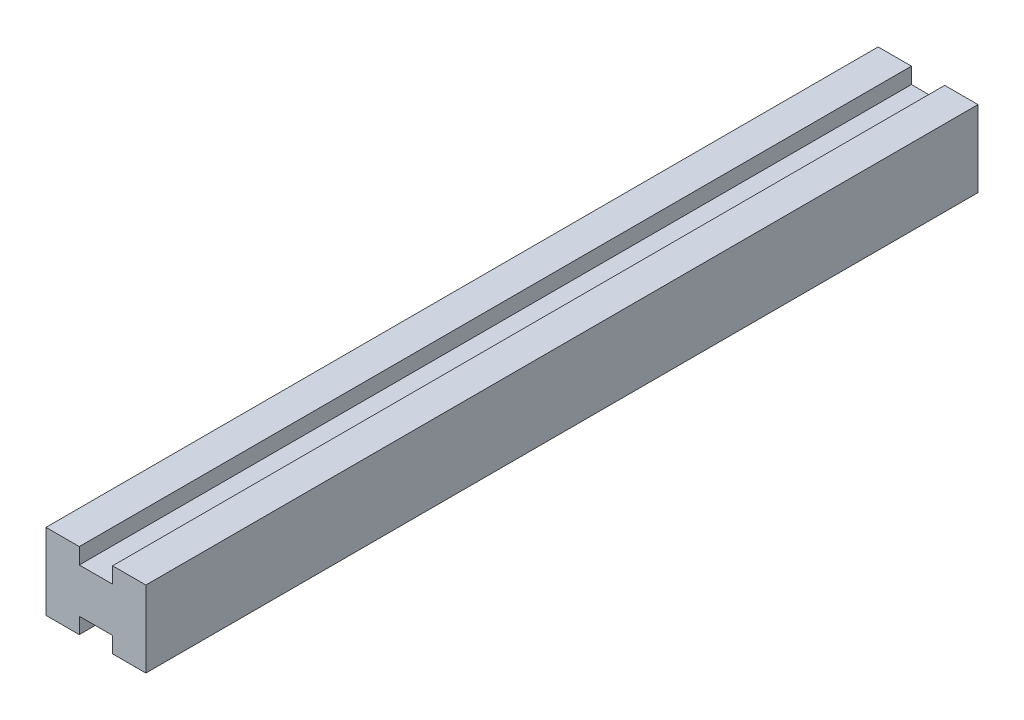
ISO-10303-21;
HEADER;
FILE_DESCRIPTION(('STEP AP214'),'2;1');
FILE_NAME('part.step','',(''),(''),'','','');
FILE_SCHEMA(('AUTOMOTIVE_DESIGN { 1 0 10303 214 1 1 1 1 }'));
ENDSEC;
DATA;
#1=APPLICATION_CONTEXT('core data for automotive mechanical design processes');
#2=APPLICATION_PROTOCOL_DEFINITION('international standard','automotive_design',2000,#1);
#3=PRODUCT_CONTEXT('',#1,'mechanical');
#4=PRODUCT('Part','Part','',(#3));
#5=PRODUCT_RELATED_PRODUCT_CATEGORY('part','',(#4));
#6=PRODUCT_DEFINITION_FORMATION('','',#4);
#7=PRODUCT_DEFINITION_CONTEXT('part definition',#1,'design');
#8=PRODUCT_DEFINITION('design','',#6,#7);
#9=PRODUCT_DEFINITION_SHAPE('','',#8);
#10=(LENGTH_UNIT() NAMED_UNIT(*) SI_UNIT(.MILLI.,.METRE.));
#11=(NAMED_UNIT(*) PLANE_ANGLE_UNIT() SI_UNIT($,.RADIAN.));
#12=(NAMED_UNIT(*) SI_UNIT($,.STERADIAN.) SOLID_ANGLE_UNIT());
#13=UNCERTAINTY_MEASURE_WITH_UNIT(LENGTH_MEASURE(1.E-05),#10,'distance_accuracy_value','');
#14=(GEOMETRIC_REPRESENTATION_CONTEXT(3) GLOBAL_UNCERTAINTY_ASSIGNED_CONTEXT((#13)) GLOBAL_UNIT_ASSIGNED_CONTEXT((#10,
#11,#12)) REPRESENTATION_CONTEXT('',''));
#15=CARTESIAN_POINT('',(0.,0.,0.));
#16=DIRECTION('',(0.,0.,1.));
#17=DIRECTION('',(1.,0.,0.));
#18=AXIS2_PLACEMENT_3D('',#15,#16,#17);
#19=CARTESIAN_POINT('',(-1.2,2.75,60.));
#20=DIRECTION('',(1.,0.,0.));
#21=DIRECTION('',(0.,1.,0.));
#22=AXIS2_PLACEMENT_3D('',#19,#20,#21);
#23=PLANE('',#22);
#24=DIRECTION('',(0.,-1.,0.));
#25=VECTOR('',#24,1.);
#26=CARTESIAN_POINT('',(-1.2,2.75,0.));
#27=LINE('',#26,#25);
#28=CARTESIAN_POINT('',(-1.2,2.75,0.));
#29=VERTEX_POINT('',#28);
#30=CARTESIAN_POINT('',(-1.2,1.6,0.));
#31=VERTEX_POINT('',#30);
#32=EDGE_CURVE('E155',#29,#31,#27,.T.);
#33=ORIENTED_EDGE('',*,*,#32,.F.);
#34=DIRECTION('',(0.,0.,-1.));
#35=VECTOR('',#34,1.);
#36=CARTESIAN_POINT('',(-1.2,2.75,60.));
#37=LINE('',#36,#35);
#38=CARTESIAN_POINT('',(-1.2,2.75,60.));
#39=VERTEX_POINT('',#38);
#40=EDGE_CURVE('E11',#39,#29,#37,.T.);
#41=ORIENTED_EDGE('',*,*,#40,.F.);
#42=DIRECTION('',(0.,-1.,0.));
#43=VECTOR('',#42,1.);
#44=CARTESIAN_POINT('',(-1.2,2.75,60.));
#45=LINE('',#44,#43);
#46=CARTESIAN_POINT('',(-1.2,1.6,60.));
#47=VERTEX_POINT('',#46);
#48=EDGE_CURVE('E183',#39,#47,#45,.T.);
#49=ORIENTED_EDGE('',*,*,#48,.T.);
#50=DIRECTION('',(0.,0.,-1.));
#51=VECTOR('',#50,1.);
#52=CARTESIAN_POINT('',(-1.2,1.6,60.));
#53=LINE('',#52,#51);
#54=EDGE_CURVE('E36',#47,#31,#53,.T.);
#55=ORIENTED_EDGE('',*,*,#54,.T.);
#56=EDGE_LOOP('',(#33,#41,#49,#55));
#57=FACE_BOUND('',#56,.T.);
#58=ADVANCED_FACE('F33',(#57),#23,.T.);
#59=CARTESIAN_POINT('',(-1.2,2.75,60.));
#60=DIRECTION('',(0.,-1.,0.));
#61=DIRECTION('',(1.,0.,0.));
#62=AXIS2_PLACEMENT_3D('',#59,#60,#61);
#63=PLANE('',#62);
#64=DIRECTION('',(-1.,0.,0.));
#65=VECTOR('',#64,1.);
#66=CARTESIAN_POINT('',(-1.2,2.75,0.));
#67=LINE('',#66,#65);
#68=CARTESIAN_POINT('',(-3.6,2.75,0.));
#69=VERTEX_POINT('',#68);
#70=EDGE_CURVE('E90',#29,#69,#67,.T.);
#71=ORIENTED_EDGE('',*,*,#70,.T.);
#72=DIRECTION('',(0.,0.,-1.));
#73=VECTOR('',#72,1.);
#74=CARTESIAN_POINT('',(-3.6,2.75,60.));
#75=LINE('',#74,#73);
#76=CARTESIAN_POINT('',(-3.6,2.75,60.));
#77=VERTEX_POINT('',#76);
#78=EDGE_CURVE('E42',#77,#69,#75,.T.);
#79=ORIENTED_EDGE('',*,*,#78,.F.);
#80=DIRECTION('',(-1.,0.,0.));
#81=VECTOR('',#80,1.);
#82=CARTESIAN_POINT('',(-1.2,2.75,60.));
#83=LINE('',#82,#81);
#84=EDGE_CURVE('E134',#39,#77,#83,.T.);
#85=ORIENTED_EDGE('',*,*,#84,.F.);
#86=ORIENTED_EDGE('',*,*,#40,.T.);
#87=EDGE_LOOP('',(#71,#79,#85,#86));
#88=FACE_BOUND('',#87,.T.);
#89=ADVANCED_FACE('F260',(#88),#63,.F.);
#90=CARTESIAN_POINT('',(-3.6,2.75,60.));
#91=DIRECTION('',(1.,0.,0.));
#92=DIRECTION('',(0.,0.,-1.));
#93=AXIS2_PLACEMENT_3D('',#90,#91,#92);
#94=PLANE('',#93);
#95=DIRECTION('',(0.,-1.,0.));
#96=VECTOR('',#95,1.);
#97=CARTESIAN_POINT('',(-3.6,2.75,0.));
#98=LINE('',#97,#96);
#99=CARTESIAN_POINT('',(-3.6,-2.75,0.));
#100=VERTEX_POINT('',#99);
#101=EDGE_CURVE('E141',#69,#100,#98,.T.);
#102=ORIENTED_EDGE('',*,*,#101,.T.);
#103=DIRECTION('',(0.,0.,-1.));
#104=VECTOR('',#103,1.);
#105=CARTESIAN_POINT('',(-3.6,-2.75,60.));
#106=LINE('',#105,#104);
#107=CARTESIAN_POINT('',(-3.6,-2.75,60.));
#108=VERTEX_POINT('',#107);
#109=EDGE_CURVE('E138',#108,#100,#106,.T.);
#110=ORIENTED_EDGE('',*,*,#109,.F.);
#111=DIRECTION('',(0.,-1.,0.));
#112=VECTOR('',#111,1.);
#113=CARTESIAN_POINT('',(-3.6,2.75,60.));
#114=LINE('',#113,#112);
#115=EDGE_CURVE('E127',#77,#108,#114,.T.);
#116=ORIENTED_EDGE('',*,*,#115,.F.);
#117=ORIENTED_EDGE('',*,*,#78,.T.);
#118=EDGE_LOOP('',(#102,#110,#116,#117));
#119=FACE_BOUND('',#118,.T.);
#120=ADVANCED_FACE('F139',(#119),#94,.F.);
#121=CARTESIAN_POINT('',(-1.2,-2.75,60.));
#122=DIRECTION('',(0.,-1.,0.));
#123=DIRECTION('',(1.,0.,0.));
#124=AXIS2_PLACEMENT_3D('',#121,#122,#123);
#125=PLANE('',#124);
#126=DIRECTION('',(-1.,0.,0.));
#127=VECTOR('',#126,1.);
#128=CARTESIAN_POINT('',(-1.2,-2.75,0.));
#129=LINE('',#128,#127);
#130=CARTESIAN_POINT('',(-1.2,-2.75,0.));
#131=VERTEX_POINT('',#130);
#132=EDGE_CURVE('E180',#131,#100,#129,.T.);
#133=ORIENTED_EDGE('',*,*,#132,.F.);
#134=DIRECTION('',(0.,0.,-1.));
#135=VECTOR('',#134,1.);
#136=CARTESIAN_POINT('',(-1.2,-2.75,60.));
#137=LINE('',#136,#135);
#138=CARTESIAN_POINT('',(-1.2,-2.75,60.));
#139=VERTEX_POINT('',#138);
#140=EDGE_CURVE('E145',#139,#131,#137,.T.);
#141=ORIENTED_EDGE('',*,*,#140,.F.);
#142=DIRECTION('',(-1.,0.,0.));
#143=VECTOR('',#142,1.);
#144=CARTESIAN_POINT('',(-1.2,-2.75,60.));
#145=LINE('',#144,#143);
#146=EDGE_CURVE('E132',#139,#108,#145,.T.);
#147=ORIENTED_EDGE('',*,*,#146,.T.);
#148=ORIENTED_EDGE('',*,*,#109,.T.);
#149=EDGE_LOOP('',(#133,#141,#147,#148));
#150=FACE_BOUND('',#149,.T.);
#151=ADVANCED_FACE('F147',(#150),#125,.T.);
#152=CARTESIAN_POINT('',(-1.2,-1.6,60.));
#153=DIRECTION('',(1.,0.,0.));
#154=DIRECTION('',(0.,0.,-1.));
#155=AXIS2_PLACEMENT_3D('',#152,#153,#154);
#156=PLANE('',#155);
#157=DIRECTION('',(0.,-1.,0.));
#158=VECTOR('',#157,1.);
#159=CARTESIAN_POINT('',(-1.2,-1.6,0.));
#160=LINE('',#159,#158);
#161=CARTESIAN_POINT('',(-1.2,-1.6,0.));
#162=VERTEX_POINT('',#161);
#163=EDGE_CURVE('E177',#162,#131,#160,.T.);
#164=ORIENTED_EDGE('',*,*,#163,.F.);
#165=DIRECTION('',(0.,0.,-1.));
#166=VECTOR('',#165,1.);
#167=CARTESIAN_POINT('',(-1.2,-1.6,60.));
#168=LINE('',#167,#166);
#169=CARTESIAN_POINT('',(-1.2,-1.6,60.));
#170=VERTEX_POINT('',#169);
#171=EDGE_CURVE('E187',#170,#162,#168,.T.);
#172=ORIENTED_EDGE('',*,*,#171,.F.);
#173=DIRECTION('',(0.,-1.,0.));
#174=VECTOR('',#173,1.);
#175=CARTESIAN_POINT('',(-1.2,-1.6,60.));
#176=LINE('',#175,#174);
#177=EDGE_CURVE('E148',#170,#139,#176,.T.);
#178=ORIENTED_EDGE('',*,*,#177,.T.);
#179=ORIENTED_EDGE('',*,*,#140,.T.);
#180=EDGE_LOOP('',(#164,#172,#178,#179));
#181=FACE_BOUND('',#180,.T.);
#182=ADVANCED_FACE('F212',(#181),#156,.T.);
#183=CARTESIAN_POINT('',(1.19999999999997,-1.60000000000001,60.));
#184=DIRECTION('',(0.,-1.,0.));
#185=DIRECTION('',(1.,0.,0.));
#186=AXIS2_PLACEMENT_3D('',#183,#184,#185);
#187=PLANE('',#186);
#188=DIRECTION('',(-1.,0.,0.));
#189=VECTOR('',#188,1.);
#190=CARTESIAN_POINT('',(1.19999999999997,-1.60000000000001,0.));
#191=LINE('',#190,#189);
#192=CARTESIAN_POINT('',(1.19999999999997,-1.60000000000001,0.));
#193=VERTEX_POINT('',#192);
#194=EDGE_CURVE('E174',#193,#162,#191,.T.);
#195=ORIENTED_EDGE('',*,*,#194,.F.);
#196=DIRECTION('',(0.,0.,-1.));
#197=VECTOR('',#196,1.);
#198=CARTESIAN_POINT('',(1.19999999999997,-1.60000000000001,60.));
#199=LINE('',#198,#197);
#200=CARTESIAN_POINT('',(1.19999999999997,-1.60000000000001,60.));
#201=VERTEX_POINT('',#200);
#202=EDGE_CURVE('E189',#201,#193,#199,.T.);
#203=ORIENTED_EDGE('',*,*,#202,.F.);
#204=DIRECTION('',(-1.,0.,0.));
#205=VECTOR('',#204,1.);
#206=CARTESIAN_POINT('',(1.19999999999997,-1.60000000000001,60.));
#207=LINE('',#206,#205);
#208=EDGE_CURVE('E150',#201,#170,#207,.T.);
#209=ORIENTED_EDGE('',*,*,#208,.T.);
#210=ORIENTED_EDGE('',*,*,#171,.T.);
#211=EDGE_LOOP('',(#195,#203,#209,#210));
#212=FACE_BOUND('',#211,.T.);
#213=ADVANCED_FACE('F216',(#212),#187,.T.);
#214=CARTESIAN_POINT('',(1.19999999999997,-1.60000000000001,60.));
#215=DIRECTION('',(1.,0.,0.));
#216=DIRECTION('',(0.,0.,-1.));
#217=AXIS2_PLACEMENT_3D('',#214,#215,#216);
#218=PLANE('',#217);
#219=DIRECTION('',(0.,-1.,0.));
#220=VECTOR('',#219,1.);
#221=CARTESIAN_POINT('',(1.19999999999997,-1.60000000000001,0.));
#222=LINE('',#221,#220);
#223=CARTESIAN_POINT('',(1.19999999999997,-2.75,0.));
#224=VERTEX_POINT('',#223);
#225=EDGE_CURVE('E172',#193,#224,#222,.T.);
#226=ORIENTED_EDGE('',*,*,#225,.T.);
#227=DIRECTION('',(0.,0.,-1.));
#228=VECTOR('',#227,1.);
#229=CARTESIAN_POINT('',(1.19999999999997,-2.75,60.));
#230=LINE('',#229,#228);
#231=CARTESIAN_POINT('',(1.19999999999997,-2.75,60.));
#232=VERTEX_POINT('',#231);
#233=EDGE_CURVE('E191',#232,#224,#230,.T.);
#234=ORIENTED_EDGE('',*,*,#233,.F.);
#235=DIRECTION('',(0.,-1.,0.));
#236=VECTOR('',#235,1.);
#237=CARTESIAN_POINT('',(1.19999999999997,-1.60000000000001,60.));
#238=LINE('',#237,#236);
#239=EDGE_CURVE('E218',#201,#232,#238,.T.);
#240=ORIENTED_EDGE('',*,*,#239,.F.);
#241=ORIENTED_EDGE('',*,*,#202,.T.);
#242=EDGE_LOOP('',(#226,#234,#240,#241));
#243=FACE_BOUND('',#242,.T.);
#244=ADVANCED_FACE('F250',(#243),#218,.F.);
#245=CARTESIAN_POINT('',(1.19999999999997,-2.75,60.));
#246=DIRECTION('',(0.,1.,0.));
#247=DIRECTION('',(0.,0.,1.));
#248=AXIS2_PLACEMENT_3D('',#245,#246,#247);
#249=PLANE('',#248);
#250=DIRECTION('',(1.,0.,0.));
#251=VECTOR('',#250,1.);
#252=CARTESIAN_POINT('',(1.19999999999997,-2.75,0.));
#253=LINE('',#252,#251);
#254=CARTESIAN_POINT('',(3.59999999999998,-2.75,0.));
#255=VERTEX_POINT('',#254);
#256=EDGE_CURVE('E169',#224,#255,#253,.T.);
#257=ORIENTED_EDGE('',*,*,#256,.T.);
#258=DIRECTION('',(0.,0.,-1.));
#259=VECTOR('',#258,1.);
#260=CARTESIAN_POINT('',(3.59999999999998,-2.75,60.));
#261=LINE('',#260,#259);
#262=CARTESIAN_POINT('',(3.59999999999998,-2.75,60.));
#263=VERTEX_POINT('',#262);
#264=EDGE_CURVE('E194',#263,#255,#261,.T.);
#265=ORIENTED_EDGE('',*,*,#264,.F.);
#266=DIRECTION('',(1.,0.,0.));
#267=VECTOR('',#266,1.);
#268=CARTESIAN_POINT('',(1.19999999999997,-2.75,60.));
#269=LINE('',#268,#267);
#270=EDGE_CURVE('E219',#232,#263,#269,.T.);
#271=ORIENTED_EDGE('',*,*,#270,.F.);
#272=ORIENTED_EDGE('',*,*,#233,.T.);
#273=EDGE_LOOP('',(#257,#265,#271,#272));
#274=FACE_BOUND('',#273,.T.);
#275=ADVANCED_FACE('F246',(#274),#249,.F.);
#276=CARTESIAN_POINT('',(3.59999999999998,2.75,60.));
#277=DIRECTION('',(1.,0.,0.));
#278=DIRECTION('',(0.,0.,-1.));
#279=AXIS2_PLACEMENT_3D('',#276,#277,#278);
#280=PLANE('',#279);
#281=DIRECTION('',(0.,-1.,0.));
#282=VECTOR('',#281,1.);
#283=CARTESIAN_POINT('',(3.59999999999998,2.75,0.));
#284=LINE('',#283,#282);
#285=CARTESIAN_POINT('',(3.59999999999998,2.75,0.));
#286=VERTEX_POINT('',#285);
#287=EDGE_CURVE('E166',#286,#255,#284,.T.);
#288=ORIENTED_EDGE('',*,*,#287,.F.);
#289=DIRECTION('',(0.,0.,-1.));
#290=VECTOR('',#289,1.);
#291=CARTESIAN_POINT('',(3.59999999999998,2.75,60.));
#292=LINE('',#291,#290);
#293=CARTESIAN_POINT('',(3.59999999999998,2.75,60.));
#294=VERTEX_POINT('',#293);
#295=EDGE_CURVE('E196',#294,#286,#292,.T.);
#296=ORIENTED_EDGE('',*,*,#295,.F.);
#297=DIRECTION('',(0.,-1.,0.));
#298=VECTOR('',#297,1.);
#299=CARTESIAN_POINT('',(3.59999999999998,2.75,60.));
#300=LINE('',#299,#298);
#301=EDGE_CURVE('E223',#294,#263,#300,.T.);
#302=ORIENTED_EDGE('',*,*,#301,.T.);
#303=ORIENTED_EDGE('',*,*,#264,.T.);
#304=EDGE_LOOP('',(#288,#296,#302,#303));
#305=FACE_BOUND('',#304,.T.);
#306=ADVANCED_FACE('F242',(#305),#280,.T.);
#307=CARTESIAN_POINT('',(1.19999999999997,2.75,60.));
#308=DIRECTION('',(0.,1.,0.));
#309=DIRECTION('',(0.,0.,1.));
#310=AXIS2_PLACEMENT_3D('',#307,#308,#309);
#311=PLANE('',#310);
#312=DIRECTION('',(1.,0.,0.));
#313=VECTOR('',#312,1.);
#314=CARTESIAN_POINT('',(1.19999999999997,2.75,0.));
#315=LINE('',#314,#313);
#316=CARTESIAN_POINT('',(1.19999999999997,2.75,0.));
#317=VERTEX_POINT('',#316);
#318=EDGE_CURVE('E163',#317,#286,#315,.T.);
#319=ORIENTED_EDGE('',*,*,#318,.F.);
#320=DIRECTION('',(0.,0.,-1.));
#321=VECTOR('',#320,1.);
#322=CARTESIAN_POINT('',(1.19999999999997,2.75,60.));
#323=LINE('',#322,#321);
#324=CARTESIAN_POINT('',(1.19999999999997,2.75,60.));
#325=VERTEX_POINT('',#324);
#326=EDGE_CURVE('E198',#325,#317,#323,.T.);
#327=ORIENTED_EDGE('',*,*,#326,.F.);
#328=DIRECTION('',(1.,0.,0.));
#329=VECTOR('',#328,1.);
#330=CARTESIAN_POINT('',(1.19999999999997,2.75,60.));
#331=LINE('',#330,#329);
#332=EDGE_CURVE('E226',#325,#294,#331,.T.);
#333=ORIENTED_EDGE('',*,*,#332,.T.);
#334=ORIENTED_EDGE('',*,*,#295,.T.);
#335=EDGE_LOOP('',(#319,#327,#333,#334));
#336=FACE_BOUND('',#335,.T.);
#337=ADVANCED_FACE('F239',(#336),#311,.T.);
#338=CARTESIAN_POINT('',(1.19999999999997,2.75,60.));
#339=DIRECTION('',(1.,0.,0.));
#340=DIRECTION('',(0.,1.,0.));
#341=AXIS2_PLACEMENT_3D('',#338,#339,#340);
#342=PLANE('',#341);
#343=DIRECTION('',(0.,-1.,0.));
#344=VECTOR('',#343,1.);
#345=CARTESIAN_POINT('',(1.19999999999997,2.75,0.));
#346=LINE('',#345,#344);
#347=CARTESIAN_POINT('',(1.19999999999997,1.6,0.));
#348=VERTEX_POINT('',#347);
#349=EDGE_CURVE('E161',#317,#348,#346,.T.);
#350=ORIENTED_EDGE('',*,*,#349,.T.);
#351=DIRECTION('',(0.,0.,-1.));
#352=VECTOR('',#351,1.);
#353=CARTESIAN_POINT('',(1.19999999999997,1.6,60.));
#354=LINE('',#353,#352);
#355=CARTESIAN_POINT('',(1.19999999999997,1.6,60.));
#356=VERTEX_POINT('',#355);
#357=EDGE_CURVE('E199',#356,#348,#354,.T.);
#358=ORIENTED_EDGE('',*,*,#357,.F.);
#359=DIRECTION('',(0.,-1.,0.));
#360=VECTOR('',#359,1.);
#361=CARTESIAN_POINT('',(1.19999999999997,2.75,60.));
#362=LINE('',#361,#360);
#363=EDGE_CURVE('E229',#325,#356,#362,.T.);
#364=ORIENTED_EDGE('',*,*,#363,.F.);
#365=ORIENTED_EDGE('',*,*,#326,.T.);
#366=EDGE_LOOP('',(#350,#358,#364,#365));
#367=FACE_BOUND('',#366,.T.);
#368=ADVANCED_FACE('F236',(#367),#342,.F.);
#369=CARTESIAN_POINT('',(1.19999999999997,1.6,60.));
#370=DIRECTION('',(0.,-1.,0.));
#371=DIRECTION('',(0.,0.,-1.));
#372=AXIS2_PLACEMENT_3D('',#369,#370,#371);
#373=PLANE('',#372);
#374=DIRECTION('',(-1.,0.,0.));
#375=VECTOR('',#374,1.);
#376=CARTESIAN_POINT('',(1.19999999999997,1.6,0.));
#377=LINE('',#376,#375);
#378=EDGE_CURVE('E158',#348,#31,#377,.T.);
#379=ORIENTED_EDGE('',*,*,#378,.T.);
#380=ORIENTED_EDGE('',*,*,#54,.F.);
#381=DIRECTION('',(-1.,0.,0.));
#382=VECTOR('',#381,1.);
#383=CARTESIAN_POINT('',(1.19999999999997,1.6,60.));
#384=LINE('',#383,#382);
#385=EDGE_CURVE('E100',#356,#47,#384,.T.);
#386=ORIENTED_EDGE('',*,*,#385,.F.);
#387=ORIENTED_EDGE('',*,*,#357,.T.);
#388=EDGE_LOOP('',(#379,#380,#386,#387));
#389=FACE_BOUND('',#388,.T.);
#390=ADVANCED_FACE('F204',(#389),#373,.F.);
#391=CARTESIAN_POINT('',(0.,0.,60.));
#392=DIRECTION('',(0.,0.,-1.));
#393=DIRECTION('',(-1.,0.,0.));
#394=AXIS2_PLACEMENT_3D('',#391,#392,#393);
#395=PLANE('',#394);
#396=ORIENTED_EDGE('',*,*,#48,.F.);
#397=ORIENTED_EDGE('',*,*,#84,.T.);
#398=ORIENTED_EDGE('',*,*,#115,.T.);
#399=ORIENTED_EDGE('',*,*,#146,.F.);
#400=ORIENTED_EDGE('',*,*,#177,.F.);
#401=ORIENTED_EDGE('',*,*,#208,.F.);
#402=ORIENTED_EDGE('',*,*,#239,.T.);
#403=ORIENTED_EDGE('',*,*,#270,.T.);
#404=ORIENTED_EDGE('',*,*,#301,.F.);
#405=ORIENTED_EDGE('',*,*,#332,.F.);
#406=ORIENTED_EDGE('',*,*,#363,.T.);
#407=ORIENTED_EDGE('',*,*,#385,.T.);
#408=EDGE_LOOP('',(#396,#397,#398,#399,#400,#401,#402,#403,#404,#405,#406,#407));
#409=FACE_BOUND('',#408,.T.);
#410=ADVANCED_FACE('F129',(#409),#395,.F.);
#411=CARTESIAN_POINT('',(0.,0.,0.));
#412=DIRECTION('',(0.,0.,-1.));
#413=DIRECTION('',(-1.,0.,0.));
#414=AXIS2_PLACEMENT_3D('',#411,#412,#413);
#415=PLANE('',#414);
#416=ORIENTED_EDGE('',*,*,#32,.T.);
#417=ORIENTED_EDGE('',*,*,#378,.F.);
#418=ORIENTED_EDGE('',*,*,#349,.F.);
#419=ORIENTED_EDGE('',*,*,#318,.T.);
#420=ORIENTED_EDGE('',*,*,#287,.T.);
#421=ORIENTED_EDGE('',*,*,#256,.F.);
#422=ORIENTED_EDGE('',*,*,#225,.F.);
#423=ORIENTED_EDGE('',*,*,#194,.T.);
#424=ORIENTED_EDGE('',*,*,#163,.T.);
#425=ORIENTED_EDGE('',*,*,#132,.T.);
#426=ORIENTED_EDGE('',*,*,#101,.F.);
#427=ORIENTED_EDGE('',*,*,#70,.F.);
#428=EDGE_LOOP('',(#416,#417,#418,#419,#420,#421,#422,#423,#424,#425,#426,#427));
#429=FACE_BOUND('',#428,.T.);
#430=ADVANCED_FACE('F207',(#429),#415,.T.);
#431=CLOSED_SHELL('',(#58,#89,#120,#151,#182,#213,#244,#275,#306,#337,#368,#390,#410,#430));
#432=MANIFOLD_SOLID_BREP('B2',#431);
#433=ADVANCED_BREP_SHAPE_REPRESENTATION('',(#18,#432),#14);
#434=SHAPE_DEFINITION_REPRESENTATION(#9,#433);
ENDSEC;
END-ISO-10303-21;
